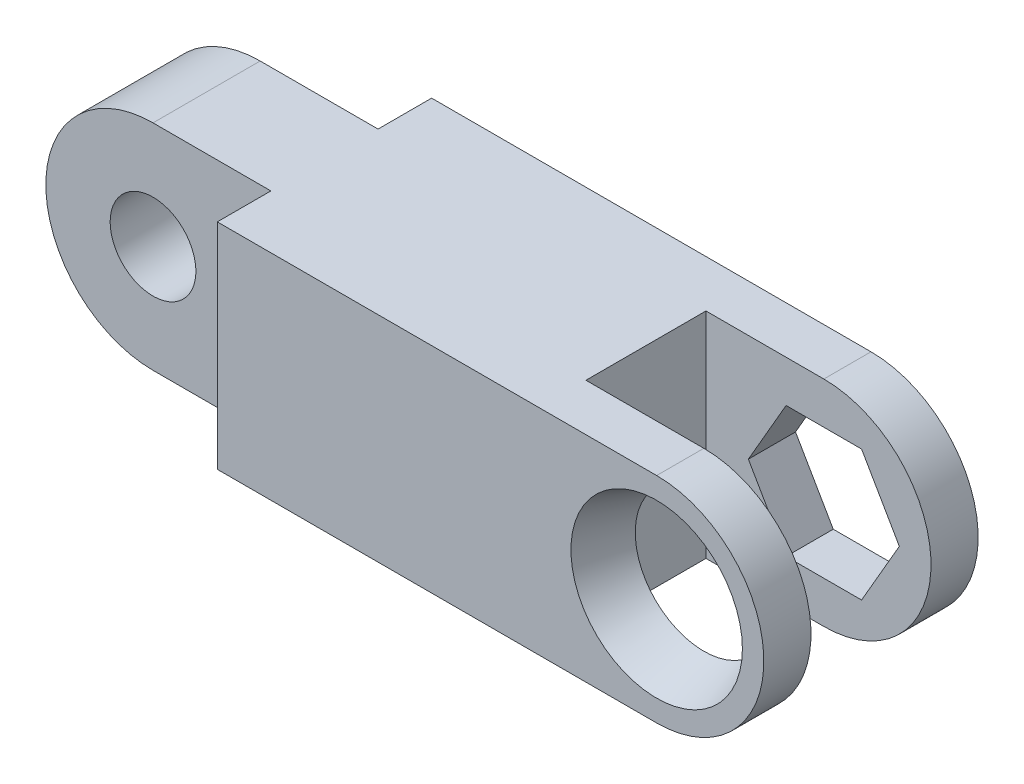
ISO-10303-21;
HEADER;
FILE_DESCRIPTION(('STEP AP214'),'2;1');
FILE_NAME('part.step','',(''),(''),'','','');
FILE_SCHEMA(('AUTOMOTIVE_DESIGN { 1 0 10303 214 1 1 1 1 }'));
ENDSEC;
DATA;
#1=APPLICATION_CONTEXT('core data for automotive mechanical design processes');
#2=APPLICATION_PROTOCOL_DEFINITION('international standard','automotive_design',2000,#1);
#3=PRODUCT_CONTEXT('',#1,'mechanical');
#4=PRODUCT('Part','Part','',(#3));
#5=PRODUCT_RELATED_PRODUCT_CATEGORY('part','',(#4));
#6=PRODUCT_DEFINITION_FORMATION('','',#4);
#7=PRODUCT_DEFINITION_CONTEXT('part definition',#1,'design');
#8=PRODUCT_DEFINITION('design','',#6,#7);
#9=PRODUCT_DEFINITION_SHAPE('','',#8);
#10=(LENGTH_UNIT() NAMED_UNIT(*) SI_UNIT(.MILLI.,.METRE.));
#11=(NAMED_UNIT(*) PLANE_ANGLE_UNIT() SI_UNIT($,.RADIAN.));
#12=(NAMED_UNIT(*) SI_UNIT($,.STERADIAN.) SOLID_ANGLE_UNIT());
#13=UNCERTAINTY_MEASURE_WITH_UNIT(LENGTH_MEASURE(1.E-05),#10,'distance_accuracy_value','');
#14=(GEOMETRIC_REPRESENTATION_CONTEXT(3) GLOBAL_UNCERTAINTY_ASSIGNED_CONTEXT((#13)) GLOBAL_UNIT_ASSIGNED_CONTEXT((#10,
#11,#12)) REPRESENTATION_CONTEXT('',''));
#15=CARTESIAN_POINT('',(0.,0.,0.));
#16=DIRECTION('',(0.,0.,1.));
#17=DIRECTION('',(1.,0.,0.));
#18=AXIS2_PLACEMENT_3D('',#15,#16,#17);
#19=CARTESIAN_POINT('',(13.,0.,10.));
#20=DIRECTION('',(0.,0.,-1.));
#21=DIRECTION('',(-1.,0.,0.));
#22=AXIS2_PLACEMENT_3D('',#19,#20,#21);
#23=CYLINDRICAL_SURFACE('',#22,5.);
#24=DIRECTION('',(0.,0.,-1.));
#25=VECTOR('',#24,1.);
#26=CARTESIAN_POINT('',(13.,5.,10.));
#27=LINE('',#26,#25);
#28=CARTESIAN_POINT('',(13.,5.,2.2));
#29=VERTEX_POINT('',#28);
#30=CARTESIAN_POINT('',(13.,5.,0.));
#31=VERTEX_POINT('',#30);
#32=EDGE_CURVE('E293',#29,#31,#27,.T.);
#33=ORIENTED_EDGE('',*,*,#32,.F.);
#34=CARTESIAN_POINT('',(13.,0.,2.2));
#35=DIRECTION('',(0.,0.,-1.));
#36=DIRECTION('',(-1.,0.,0.));
#37=AXIS2_PLACEMENT_3D('',#34,#35,#36);
#38=CIRCLE('',#37,5.);
#39=CARTESIAN_POINT('',(13.,-5.,2.2));
#40=VERTEX_POINT('',#39);
#41=EDGE_CURVE('E265',#29,#40,#38,.T.);
#42=ORIENTED_EDGE('',*,*,#41,.T.);
#43=DIRECTION('',(0.,0.,-1.));
#44=VECTOR('',#43,1.);
#45=CARTESIAN_POINT('',(13.,-5.,10.));
#46=LINE('',#45,#44);
#47=CARTESIAN_POINT('',(13.,-5.,0.));
#48=VERTEX_POINT('',#47);
#49=EDGE_CURVE('E277',#40,#48,#46,.T.);
#50=ORIENTED_EDGE('',*,*,#49,.T.);
#51=CARTESIAN_POINT('',(13.,0.,0.));
#52=DIRECTION('',(0.,0.,1.));
#53=DIRECTION('',(-1.,0.,0.));
#54=AXIS2_PLACEMENT_3D('',#51,#52,#53);
#55=CIRCLE('',#54,5.);
#56=EDGE_CURVE('E267',#48,#31,#55,.T.);
#57=ORIENTED_EDGE('',*,*,#56,.T.);
#58=EDGE_LOOP('',(#33,#42,#50,#57));
#59=FACE_BOUND('',#58,.T.);
#60=ADVANCED_FACE('F39',(#59),#23,.T.);
#61=CARTESIAN_POINT('',(13.,0.,7.8));
#62=DIRECTION('',(0.,0.,1.));
#63=DIRECTION('',(1.,0.,0.));
#64=AXIS2_PLACEMENT_3D('',#61,#62,#63);
#65=CIRCLE('',#64,5.);
#66=CARTESIAN_POINT('',(13.,-5.,7.8));
#67=VERTEX_POINT('',#66);
#68=CARTESIAN_POINT('',(13.,5.,7.8));
#69=VERTEX_POINT('',#68);
#70=EDGE_CURVE('E262',#67,#69,#65,.T.);
#71=ORIENTED_EDGE('',*,*,#70,.T.);
#72=CARTESIAN_POINT('',(13.,5.,10.));
#73=VERTEX_POINT('',#72);
#74=EDGE_CURVE('E294',#73,#69,#27,.T.);
#75=ORIENTED_EDGE('',*,*,#74,.F.);
#76=CARTESIAN_POINT('',(13.,0.,10.));
#77=DIRECTION('',(0.,0.,1.));
#78=DIRECTION('',(-1.,0.,0.));
#79=AXIS2_PLACEMENT_3D('',#76,#77,#78);
#80=CIRCLE('',#79,5.);
#81=CARTESIAN_POINT('',(13.,-5.,10.));
#82=VERTEX_POINT('',#81);
#83=EDGE_CURVE('E268',#82,#73,#80,.T.);
#84=ORIENTED_EDGE('',*,*,#83,.F.);
#85=EDGE_CURVE('E284',#82,#67,#46,.T.);
#86=ORIENTED_EDGE('',*,*,#85,.T.);
#87=EDGE_LOOP('',(#71,#75,#84,#86));
#88=FACE_BOUND('',#87,.T.);
#89=ADVANCED_FACE('F41',(#88),#23,.T.);
#90=CARTESIAN_POINT('',(-13.,5.,10.));
#91=DIRECTION('',(0.,-1.,0.));
#92=DIRECTION('',(0.,0.,-1.));
#93=AXIS2_PLACEMENT_3D('',#90,#91,#92);
#94=PLANE('',#93);
#95=DIRECTION('',(-1.,0.,0.));
#96=VECTOR('',#95,1.);
#97=CARTESIAN_POINT('',(-13.,5.,0.));
#98=LINE('',#97,#96);
#99=CARTESIAN_POINT('',(-7.50000000000001,5.,0.));
#100=VERTEX_POINT('',#99);
#101=EDGE_CURVE('E280',#31,#100,#98,.T.);
#102=ORIENTED_EDGE('',*,*,#101,.T.);
#103=DIRECTION('',(0.,0.,-1.));
#104=VECTOR('',#103,1.);
#105=CARTESIAN_POINT('',(-7.5,5.,0.));
#106=LINE('',#105,#104);
#107=CARTESIAN_POINT('',(-7.5,5.,2.5));
#108=VERTEX_POINT('',#107);
#109=EDGE_CURVE('E212',#108,#100,#106,.T.);
#110=ORIENTED_EDGE('',*,*,#109,.F.);
#111=DIRECTION('',(1.,0.,0.));
#112=VECTOR('',#111,1.);
#113=CARTESIAN_POINT('',(-18.,5.,2.5));
#114=LINE('',#113,#112);
#115=CARTESIAN_POINT('',(-13.,5.,2.5));
#116=VERTEX_POINT('',#115);
#117=EDGE_CURVE('E216',#116,#108,#114,.T.);
#118=ORIENTED_EDGE('',*,*,#117,.F.);
#119=DIRECTION('',(0.,0.,-1.));
#120=VECTOR('',#119,1.);
#121=CARTESIAN_POINT('',(-13.,5.,10.));
#122=LINE('',#121,#120);
#123=CARTESIAN_POINT('',(-13.,5.,7.5));
#124=VERTEX_POINT('',#123);
#125=EDGE_CURVE('E290',#124,#116,#122,.T.);
#126=ORIENTED_EDGE('',*,*,#125,.F.);
#127=DIRECTION('',(-1.,0.,0.));
#128=VECTOR('',#127,1.);
#129=CARTESIAN_POINT('',(-18.,5.,7.5));
#130=LINE('',#129,#128);
#131=CARTESIAN_POINT('',(-7.5,5.,7.5));
#132=VERTEX_POINT('',#131);
#133=EDGE_CURVE('E231',#132,#124,#130,.T.);
#134=ORIENTED_EDGE('',*,*,#133,.F.);
#135=DIRECTION('',(0.,0.,-1.));
#136=VECTOR('',#135,1.);
#137=CARTESIAN_POINT('',(-7.5,5.,10.));
#138=LINE('',#137,#136);
#139=CARTESIAN_POINT('',(-7.5,5.,10.));
#140=VERTEX_POINT('',#139);
#141=EDGE_CURVE('E218',#140,#132,#138,.T.);
#142=ORIENTED_EDGE('',*,*,#141,.F.);
#143=DIRECTION('',(-1.,0.,0.));
#144=VECTOR('',#143,1.);
#145=CARTESIAN_POINT('',(-13.,5.,10.));
#146=LINE('',#145,#144);
#147=EDGE_CURVE('E271',#73,#140,#146,.T.);
#148=ORIENTED_EDGE('',*,*,#147,.F.);
#149=ORIENTED_EDGE('',*,*,#74,.T.);
#150=DIRECTION('',(1.,0.,0.));
#151=VECTOR('',#150,1.);
#152=CARTESIAN_POINT('',(7.50000000000002,5.,7.8));
#153=LINE('',#152,#151);
#154=CARTESIAN_POINT('',(7.50000000000002,5.,7.8));
#155=VERTEX_POINT('',#154);
#156=EDGE_CURVE('E255',#155,#69,#153,.T.);
#157=ORIENTED_EDGE('',*,*,#156,.F.);
#158=DIRECTION('',(0.,0.,1.));
#159=VECTOR('',#158,1.);
#160=CARTESIAN_POINT('',(7.50000000000002,5.,7.8));
#161=LINE('',#160,#159);
#162=CARTESIAN_POINT('',(7.50000000000002,5.,2.2));
#163=VERTEX_POINT('',#162);
#164=EDGE_CURVE('E244',#163,#155,#161,.T.);
#165=ORIENTED_EDGE('',*,*,#164,.F.);
#166=DIRECTION('',(-1.,0.,0.));
#167=VECTOR('',#166,1.);
#168=CARTESIAN_POINT('',(7.50000000000002,5.,2.2));
#169=LINE('',#168,#167);
#170=EDGE_CURVE('E249',#29,#163,#169,.T.);
#171=ORIENTED_EDGE('',*,*,#170,.F.);
#172=ORIENTED_EDGE('',*,*,#32,.T.);
#173=EDGE_LOOP('',(#102,#110,#118,#126,#134,#142,#148,#149,#157,#165,#171,#172));
#174=FACE_BOUND('',#173,.T.);
#175=ADVANCED_FACE('F381',(#174),#94,.F.);
#176=CARTESIAN_POINT('',(-13.,0.,10.));
#177=DIRECTION('',(0.,0.,-1.));
#178=DIRECTION('',(-1.,0.,0.));
#179=AXIS2_PLACEMENT_3D('',#176,#177,#178);
#180=CYLINDRICAL_SURFACE('',#179,5.);
#181=ORIENTED_EDGE('',*,*,#125,.T.);
#182=CARTESIAN_POINT('',(-13.,0.,2.5));
#183=DIRECTION('',(0.,0.,1.));
#184=DIRECTION('',(1.,0.,0.));
#185=AXIS2_PLACEMENT_3D('',#182,#183,#184);
#186=CIRCLE('',#185,5.);
#187=CARTESIAN_POINT('',(-13.,-5.,2.5));
#188=VERTEX_POINT('',#187);
#189=EDGE_CURVE('E242',#116,#188,#186,.T.);
#190=ORIENTED_EDGE('',*,*,#189,.T.);
#191=DIRECTION('',(0.,0.,-1.));
#192=VECTOR('',#191,1.);
#193=CARTESIAN_POINT('',(-13.,-5.,10.));
#194=LINE('',#193,#192);
#195=CARTESIAN_POINT('',(-13.,-5.,7.5));
#196=VERTEX_POINT('',#195);
#197=EDGE_CURVE('E287',#196,#188,#194,.T.);
#198=ORIENTED_EDGE('',*,*,#197,.F.);
#199=CARTESIAN_POINT('',(-13.,0.,7.5));
#200=DIRECTION('',(0.,0.,-1.));
#201=DIRECTION('',(-1.,0.,0.));
#202=AXIS2_PLACEMENT_3D('',#199,#200,#201);
#203=CIRCLE('',#202,5.);
#204=EDGE_CURVE('E223',#196,#124,#203,.T.);
#205=ORIENTED_EDGE('',*,*,#204,.T.);
#206=EDGE_LOOP('',(#181,#190,#198,#205));
#207=FACE_BOUND('',#206,.T.);
#208=ADVANCED_FACE('F347',(#207),#180,.T.);
#209=CARTESIAN_POINT('',(-13.,-5.,10.));
#210=DIRECTION('',(0.,1.,0.));
#211=DIRECTION('',(0.,0.,1.));
#212=AXIS2_PLACEMENT_3D('',#209,#210,#211);
#213=PLANE('',#212);
#214=DIRECTION('',(1.,0.,0.));
#215=VECTOR('',#214,1.);
#216=CARTESIAN_POINT('',(-18.,-5.,2.5));
#217=LINE('',#216,#215);
#218=CARTESIAN_POINT('',(-7.5,-5.,2.5));
#219=VERTEX_POINT('',#218);
#220=EDGE_CURVE('E208',#188,#219,#217,.T.);
#221=ORIENTED_EDGE('',*,*,#220,.T.);
#222=DIRECTION('',(0.,0.,-1.));
#223=VECTOR('',#222,1.);
#224=CARTESIAN_POINT('',(-7.5,-5.,0.));
#225=LINE('',#224,#223);
#226=CARTESIAN_POINT('',(-7.5,-5.,0.));
#227=VERTEX_POINT('',#226);
#228=EDGE_CURVE('E211',#219,#227,#225,.T.);
#229=ORIENTED_EDGE('',*,*,#228,.T.);
#230=DIRECTION('',(1.,0.,0.));
#231=VECTOR('',#230,1.);
#232=CARTESIAN_POINT('',(-13.,-5.,0.));
#233=LINE('',#232,#231);
#234=EDGE_CURVE('E272',#227,#48,#233,.T.);
#235=ORIENTED_EDGE('',*,*,#234,.T.);
#236=ORIENTED_EDGE('',*,*,#49,.F.);
#237=DIRECTION('',(-1.,0.,0.));
#238=VECTOR('',#237,1.);
#239=CARTESIAN_POINT('',(-13.,-5.,2.2));
#240=LINE('',#239,#238);
#241=CARTESIAN_POINT('',(7.50000000000002,-5.,2.2));
#242=VERTEX_POINT('',#241);
#243=EDGE_CURVE('E297',#40,#242,#240,.T.);
#244=ORIENTED_EDGE('',*,*,#243,.T.);
#245=DIRECTION('',(0.,0.,1.));
#246=VECTOR('',#245,1.);
#247=CARTESIAN_POINT('',(7.50000000000002,-5.,7.8));
#248=LINE('',#247,#246);
#249=CARTESIAN_POINT('',(7.50000000000002,-5.,7.8));
#250=VERTEX_POINT('',#249);
#251=EDGE_CURVE('E245',#242,#250,#248,.T.);
#252=ORIENTED_EDGE('',*,*,#251,.T.);
#253=DIRECTION('',(1.,0.,0.));
#254=VECTOR('',#253,1.);
#255=CARTESIAN_POINT('',(7.50000000000002,-5.,7.8));
#256=LINE('',#255,#254);
#257=EDGE_CURVE('E248',#250,#67,#256,.T.);
#258=ORIENTED_EDGE('',*,*,#257,.T.);
#259=ORIENTED_EDGE('',*,*,#85,.F.);
#260=DIRECTION('',(1.,0.,0.));
#261=VECTOR('',#260,1.);
#262=CARTESIAN_POINT('',(-13.,-5.,10.));
#263=LINE('',#262,#261);
#264=CARTESIAN_POINT('',(-7.5,-5.,10.));
#265=VERTEX_POINT('',#264);
#266=EDGE_CURVE('E275',#265,#82,#263,.T.);
#267=ORIENTED_EDGE('',*,*,#266,.F.);
#268=DIRECTION('',(0.,0.,-1.));
#269=VECTOR('',#268,1.);
#270=CARTESIAN_POINT('',(-7.5,-5.,10.));
#271=LINE('',#270,#269);
#272=CARTESIAN_POINT('',(-7.5,-5.,7.5));
#273=VERTEX_POINT('',#272);
#274=EDGE_CURVE('E234',#265,#273,#271,.T.);
#275=ORIENTED_EDGE('',*,*,#274,.T.);
#276=DIRECTION('',(-1.,0.,0.));
#277=VECTOR('',#276,1.);
#278=CARTESIAN_POINT('',(-18.,-5.,7.5));
#279=LINE('',#278,#277);
#280=EDGE_CURVE('E228',#273,#196,#279,.T.);
#281=ORIENTED_EDGE('',*,*,#280,.T.);
#282=ORIENTED_EDGE('',*,*,#197,.T.);
#283=EDGE_LOOP('',(#221,#229,#235,#236,#244,#252,#258,#259,#267,#275,#281,#282));
#284=FACE_BOUND('',#283,.T.);
#285=ADVANCED_FACE('F345',(#284),#213,.F.);
#286=CARTESIAN_POINT('',(13.,0.,10.));
#287=DIRECTION('',(0.,0.,-1.));
#288=DIRECTION('',(-1.,0.,0.));
#289=AXIS2_PLACEMENT_3D('',#286,#287,#288);
#290=PLANE('',#289);
#291=CARTESIAN_POINT('',(13.,0.,10.));
#292=DIRECTION('',(0.,0.,1.));
#293=DIRECTION('',(1.,0.,0.));
#294=AXIS2_PLACEMENT_3D('',#291,#292,#293);
#295=CIRCLE('',#294,4.);
#296=CARTESIAN_POINT('',(17.,0.,10.));
#297=VERTEX_POINT('',#296);
#298=EDGE_CURVE('E198',#297,#297,#295,.T.);
#299=ORIENTED_EDGE('',*,*,#298,.F.);
#300=EDGE_LOOP('',(#299));
#301=FACE_BOUND('',#300,.T.);
#302=ORIENTED_EDGE('',*,*,#147,.T.);
#303=DIRECTION('',(0.,1.,0.));
#304=VECTOR('',#303,1.);
#305=CARTESIAN_POINT('',(-7.5,-5.,10.));
#306=LINE('',#305,#304);
#307=EDGE_CURVE('E226',#265,#140,#306,.T.);
#308=ORIENTED_EDGE('',*,*,#307,.F.);
#309=ORIENTED_EDGE('',*,*,#266,.T.);
#310=ORIENTED_EDGE('',*,*,#83,.T.);
#311=EDGE_LOOP('',(#302,#308,#309,#310));
#312=FACE_BOUND('',#311,.T.);
#313=ADVANCED_FACE('F376',(#301,#312),#290,.F.);
#314=CARTESIAN_POINT('',(13.,0.,0.));
#315=DIRECTION('',(0.,0.,-1.));
#316=DIRECTION('',(-1.,0.,0.));
#317=AXIS2_PLACEMENT_3D('',#314,#315,#316);
#318=PLANE('',#317);
#319=DIRECTION('',(0.5,-0.866025403784438,0.));
#320=VECTOR('',#319,1.);
#321=CARTESIAN_POINT('',(14.7609183210284,3.05,0.));
#322=LINE('',#321,#320);
#323=CARTESIAN_POINT('',(14.7609183210284,3.05,0.));
#324=VERTEX_POINT('',#323);
#325=CARTESIAN_POINT('',(16.5218366420567,0.,0.));
#326=VERTEX_POINT('',#325);
#327=EDGE_CURVE('E55',#324,#326,#322,.T.);
#328=ORIENTED_EDGE('',*,*,#327,.F.);
#329=DIRECTION('',(1.,0.,0.));
#330=VECTOR('',#329,1.);
#331=CARTESIAN_POINT('',(11.2390816789716,3.05,0.));
#332=LINE('',#331,#330);
#333=CARTESIAN_POINT('',(11.2390816789716,3.05,0.));
#334=VERTEX_POINT('',#333);
#335=EDGE_CURVE('E193',#334,#324,#332,.T.);
#336=ORIENTED_EDGE('',*,*,#335,.F.);
#337=DIRECTION('',(0.5,0.866025403784438,0.));
#338=VECTOR('',#337,1.);
#339=CARTESIAN_POINT('',(9.47816335794328,0.,0.));
#340=LINE('',#339,#338);
#341=CARTESIAN_POINT('',(9.47816335794328,0.,0.));
#342=VERTEX_POINT('',#341);
#343=EDGE_CURVE('E187',#342,#334,#340,.T.);
#344=ORIENTED_EDGE('',*,*,#343,.F.);
#345=DIRECTION('',(-0.5,0.866025403784439,0.));
#346=VECTOR('',#345,1.);
#347=CARTESIAN_POINT('',(11.2390816789716,-3.05,0.));
#348=LINE('',#347,#346);
#349=CARTESIAN_POINT('',(11.2390816789716,-3.05,0.));
#350=VERTEX_POINT('',#349);
#351=EDGE_CURVE('E185',#350,#342,#348,.T.);
#352=ORIENTED_EDGE('',*,*,#351,.F.);
#353=DIRECTION('',(-1.,0.,0.));
#354=VECTOR('',#353,1.);
#355=CARTESIAN_POINT('',(14.7609183210284,-3.05,0.));
#356=LINE('',#355,#354);
#357=CARTESIAN_POINT('',(14.7609183210284,-3.05,0.));
#358=VERTEX_POINT('',#357);
#359=EDGE_CURVE('E168',#358,#350,#356,.T.);
#360=ORIENTED_EDGE('',*,*,#359,.F.);
#361=DIRECTION('',(-0.5,-0.866025403784439,0.));
#362=VECTOR('',#361,1.);
#363=CARTESIAN_POINT('',(16.5218366420567,0.,0.));
#364=LINE('',#363,#362);
#365=EDGE_CURVE('E177',#326,#358,#364,.T.);
#366=ORIENTED_EDGE('',*,*,#365,.F.);
#367=EDGE_LOOP('',(#328,#336,#344,#352,#360,#366));
#368=FACE_BOUND('',#367,.T.);
#369=DIRECTION('',(0.,1.,0.));
#370=VECTOR('',#369,1.);
#371=CARTESIAN_POINT('',(-7.5,-5.,0.));
#372=LINE('',#371,#370);
#373=EDGE_CURVE('E220',#227,#100,#372,.T.);
#374=ORIENTED_EDGE('',*,*,#373,.T.);
#375=ORIENTED_EDGE('',*,*,#101,.F.);
#376=ORIENTED_EDGE('',*,*,#56,.F.);
#377=ORIENTED_EDGE('',*,*,#234,.F.);
#378=EDGE_LOOP('',(#374,#375,#376,#377));
#379=FACE_BOUND('',#378,.T.);
#380=ADVANCED_FACE('F181',(#368,#379),#318,.T.);
#381=CARTESIAN_POINT('',(7.50000000000002,-5.,2.2));
#382=DIRECTION('',(0.,0.,-1.));
#383=DIRECTION('',(-1.,0.,0.));
#384=AXIS2_PLACEMENT_3D('',#381,#382,#383);
#385=PLANE('',#384);
#386=DIRECTION('',(1.,0.,0.));
#387=VECTOR('',#386,1.);
#388=CARTESIAN_POINT('',(7.50000000000002,3.05,2.2));
#389=LINE('',#388,#387);
#390=CARTESIAN_POINT('',(11.2390816789716,3.05,2.2));
#391=VERTEX_POINT('',#390);
#392=CARTESIAN_POINT('',(14.7609183210284,3.05,2.2));
#393=VERTEX_POINT('',#392);
#394=EDGE_CURVE('E48',#391,#393,#389,.T.);
#395=ORIENTED_EDGE('',*,*,#394,.T.);
#396=DIRECTION('',(0.5,-0.866025403784438,0.));
#397=VECTOR('',#396,1.);
#398=CARTESIAN_POINT('',(16.4314409910036,0.156569860407203,2.2));
#399=LINE('',#398,#397);
#400=CARTESIAN_POINT('',(16.5218366420567,0.,2.2));
#401=VERTEX_POINT('',#400);
#402=EDGE_CURVE('E11',#393,#401,#399,.T.);
#403=ORIENTED_EDGE('',*,*,#402,.T.);
#404=DIRECTION('',(-0.5,-0.866025403784439,0.));
#405=VECTOR('',#404,1.);
#406=CARTESIAN_POINT('',(12.1013139720814,-7.6565698604072,2.2));
#407=LINE('',#406,#405);
#408=CARTESIAN_POINT('',(14.7609183210284,-3.05,2.2));
#409=VERTEX_POINT('',#408);
#410=EDGE_CURVE('E300',#401,#409,#407,.T.);
#411=ORIENTED_EDGE('',*,*,#410,.T.);
#412=DIRECTION('',(-1.,0.,0.));
#413=VECTOR('',#412,1.);
#414=CARTESIAN_POINT('',(7.50000000000002,-3.05,2.2));
#415=LINE('',#414,#413);
#416=CARTESIAN_POINT('',(11.2390816789716,-3.05,2.2));
#417=VERTEX_POINT('',#416);
#418=EDGE_CURVE('E171',#409,#417,#415,.T.);
#419=ORIENTED_EDGE('',*,*,#418,.T.);
#420=DIRECTION('',(-0.5,0.866025403784439,0.));
#421=VECTOR('',#420,1.);
#422=CARTESIAN_POINT('',(11.1486860279186,-2.8934301395928,2.2));
#423=LINE('',#422,#421);
#424=CARTESIAN_POINT('',(9.47816335794328,0.,2.2));
#425=VERTEX_POINT('',#424);
#426=EDGE_CURVE('E305',#417,#425,#423,.T.);
#427=ORIENTED_EDGE('',*,*,#426,.T.);
#428=DIRECTION('',(0.5,0.866025403784439,0.));
#429=VECTOR('',#428,1.);
#430=CARTESIAN_POINT('',(6.81855900899637,-4.6065698604072,2.2));
#431=LINE('',#430,#429);
#432=EDGE_CURVE('E308',#425,#391,#431,.T.);
#433=ORIENTED_EDGE('',*,*,#432,.T.);
#434=EDGE_LOOP('',(#395,#403,#411,#419,#427,#433));
#435=FACE_BOUND('',#434,.T.);
#436=ORIENTED_EDGE('',*,*,#170,.T.);
#437=DIRECTION('',(0.,1.,0.));
#438=VECTOR('',#437,1.);
#439=CARTESIAN_POINT('',(7.50000000000002,-5.,2.2));
#440=LINE('',#439,#438);
#441=EDGE_CURVE('E259',#242,#163,#440,.T.);
#442=ORIENTED_EDGE('',*,*,#441,.F.);
#443=ORIENTED_EDGE('',*,*,#243,.F.);
#444=ORIENTED_EDGE('',*,*,#41,.F.);
#445=EDGE_LOOP('',(#436,#442,#443,#444));
#446=FACE_BOUND('',#445,.T.);
#447=ADVANCED_FACE('F313',(#435,#446),#385,.F.);
#448=CARTESIAN_POINT('',(7.50000000000002,-5.,7.8));
#449=DIRECTION('',(0.,0.,1.));
#450=DIRECTION('',(1.,0.,0.));
#451=AXIS2_PLACEMENT_3D('',#448,#449,#450);
#452=PLANE('',#451);
#453=CARTESIAN_POINT('',(13.,0.,7.8));
#454=DIRECTION('',(0.,0.,1.));
#455=DIRECTION('',(1.,0.,0.));
#456=AXIS2_PLACEMENT_3D('',#453,#454,#455);
#457=CIRCLE('',#456,3.19926548461435);
#458=CARTESIAN_POINT('',(16.1992654846144,0.,7.8));
#459=VERTEX_POINT('',#458);
#460=EDGE_CURVE('E207',#459,#459,#457,.T.);
#461=ORIENTED_EDGE('',*,*,#460,.T.);
#462=EDGE_LOOP('',(#461));
#463=FACE_BOUND('',#462,.T.);
#464=ORIENTED_EDGE('',*,*,#70,.F.);
#465=ORIENTED_EDGE('',*,*,#257,.F.);
#466=DIRECTION('',(0.,1.,0.));
#467=VECTOR('',#466,1.);
#468=CARTESIAN_POINT('',(7.50000000000002,-5.,7.8));
#469=LINE('',#468,#467);
#470=EDGE_CURVE('E252',#250,#155,#469,.T.);
#471=ORIENTED_EDGE('',*,*,#470,.T.);
#472=ORIENTED_EDGE('',*,*,#156,.T.);
#473=EDGE_LOOP('',(#464,#465,#471,#472));
#474=FACE_BOUND('',#473,.T.);
#475=ADVANCED_FACE('F370',(#463,#474),#452,.F.);
#476=CARTESIAN_POINT('',(7.50000000000002,-5.,7.8));
#477=DIRECTION('',(-1.,0.,0.));
#478=DIRECTION('',(0.,0.,1.));
#479=AXIS2_PLACEMENT_3D('',#476,#477,#478);
#480=PLANE('',#479);
#481=ORIENTED_EDGE('',*,*,#164,.T.);
#482=ORIENTED_EDGE('',*,*,#470,.F.);
#483=ORIENTED_EDGE('',*,*,#251,.F.);
#484=ORIENTED_EDGE('',*,*,#441,.T.);
#485=EDGE_LOOP('',(#481,#482,#483,#484));
#486=FACE_BOUND('',#485,.T.);
#487=ADVANCED_FACE('F366',(#486),#480,.F.);
#488=CARTESIAN_POINT('',(-18.,-5.,2.5));
#489=DIRECTION('',(0.,0.,1.));
#490=DIRECTION('',(1.,0.,0.));
#491=AXIS2_PLACEMENT_3D('',#488,#489,#490);
#492=PLANE('',#491);
#493=CARTESIAN_POINT('',(-13.,0.,2.5));
#494=DIRECTION('',(0.,0.,1.));
#495=DIRECTION('',(1.,0.,0.));
#496=AXIS2_PLACEMENT_3D('',#493,#494,#495);
#497=CIRCLE('',#496,2.);
#498=CARTESIAN_POINT('',(-11.,0.,2.5));
#499=VERTEX_POINT('',#498);
#500=EDGE_CURVE('E323',#499,#499,#497,.F.);
#501=ORIENTED_EDGE('',*,*,#500,.F.);
#502=EDGE_LOOP('',(#501));
#503=FACE_BOUND('',#502,.T.);
#504=ORIENTED_EDGE('',*,*,#117,.T.);
#505=DIRECTION('',(0.,1.,0.));
#506=VECTOR('',#505,1.);
#507=CARTESIAN_POINT('',(-7.5,-5.,2.5));
#508=LINE('',#507,#506);
#509=EDGE_CURVE('E215',#219,#108,#508,.T.);
#510=ORIENTED_EDGE('',*,*,#509,.F.);
#511=ORIENTED_EDGE('',*,*,#220,.F.);
#512=ORIENTED_EDGE('',*,*,#189,.F.);
#513=EDGE_LOOP('',(#504,#510,#511,#512));
#514=FACE_BOUND('',#513,.T.);
#515=ADVANCED_FACE('F351',(#503,#514),#492,.F.);
#516=CARTESIAN_POINT('',(-7.5,-5.,0.));
#517=DIRECTION('',(1.,0.,0.));
#518=DIRECTION('',(0.,0.,-1.));
#519=AXIS2_PLACEMENT_3D('',#516,#517,#518);
#520=PLANE('',#519);
#521=ORIENTED_EDGE('',*,*,#109,.T.);
#522=ORIENTED_EDGE('',*,*,#373,.F.);
#523=ORIENTED_EDGE('',*,*,#228,.F.);
#524=ORIENTED_EDGE('',*,*,#509,.T.);
#525=EDGE_LOOP('',(#521,#522,#523,#524));
#526=FACE_BOUND('',#525,.T.);
#527=ADVANCED_FACE('F337',(#526),#520,.F.);
#528=CARTESIAN_POINT('',(-18.,-5.,7.5));
#529=DIRECTION('',(0.,0.,-1.));
#530=DIRECTION('',(-1.,0.,0.));
#531=AXIS2_PLACEMENT_3D('',#528,#529,#530);
#532=PLANE('',#531);
#533=CARTESIAN_POINT('',(-13.,0.,7.5));
#534=DIRECTION('',(0.,0.,-1.));
#535=DIRECTION('',(-1.,0.,0.));
#536=AXIS2_PLACEMENT_3D('',#533,#534,#535);
#537=CIRCLE('',#536,2.);
#538=CARTESIAN_POINT('',(-15.,0.,7.5));
#539=VERTEX_POINT('',#538);
#540=EDGE_CURVE('E43',#539,#539,#537,.F.);
#541=ORIENTED_EDGE('',*,*,#540,.F.);
#542=EDGE_LOOP('',(#541));
#543=FACE_BOUND('',#542,.T.);
#544=ORIENTED_EDGE('',*,*,#204,.F.);
#545=ORIENTED_EDGE('',*,*,#280,.F.);
#546=DIRECTION('',(0.,1.,0.));
#547=VECTOR('',#546,1.);
#548=CARTESIAN_POINT('',(-7.5,-5.,7.5));
#549=LINE('',#548,#547);
#550=EDGE_CURVE('E229',#273,#132,#549,.T.);
#551=ORIENTED_EDGE('',*,*,#550,.T.);
#552=ORIENTED_EDGE('',*,*,#133,.T.);
#553=EDGE_LOOP('',(#544,#545,#551,#552));
#554=FACE_BOUND('',#553,.T.);
#555=ADVANCED_FACE('F333',(#543,#554),#532,.F.);
#556=CARTESIAN_POINT('',(-7.5,-5.,10.));
#557=DIRECTION('',(1.,0.,0.));
#558=DIRECTION('',(0.,0.,-1.));
#559=AXIS2_PLACEMENT_3D('',#556,#557,#558);
#560=PLANE('',#559);
#561=ORIENTED_EDGE('',*,*,#141,.T.);
#562=ORIENTED_EDGE('',*,*,#550,.F.);
#563=ORIENTED_EDGE('',*,*,#274,.F.);
#564=ORIENTED_EDGE('',*,*,#307,.T.);
#565=EDGE_LOOP('',(#561,#562,#563,#564));
#566=FACE_BOUND('',#565,.T.);
#567=ADVANCED_FACE('F336',(#566),#560,.F.);
#568=CARTESIAN_POINT('',(13.,0.,10.));
#569=DIRECTION('',(0.,0.,1.));
#570=DIRECTION('',(1.,0.,0.));
#571=AXIS2_PLACEMENT_3D('',#568,#569,#570);
#572=CONICAL_SURFACE('',#571,4.,0.349065850398867);
#573=ORIENTED_EDGE('',*,*,#298,.T.);
#574=EDGE_LOOP('',(#573));
#575=FACE_BOUND('',#574,.T.);
#576=ORIENTED_EDGE('',*,*,#460,.F.);
#577=EDGE_LOOP('',(#576));
#578=FACE_BOUND('',#577,.T.);
#579=ADVANCED_FACE('F418',(#575,#578),#572,.F.);
#580=CARTESIAN_POINT('',(14.7609183210284,3.05,2.5));
#581=DIRECTION('',(0.866025403784438,0.5,0.));
#582=DIRECTION('',(-0.5,0.866025403784438,0.));
#583=AXIS2_PLACEMENT_3D('',#580,#581,#582);
#584=PLANE('',#583);
#585=DIRECTION('',(0.,0.,-1.));
#586=VECTOR('',#585,1.);
#587=CARTESIAN_POINT('',(14.7609183210284,3.05,2.5));
#588=LINE('',#587,#586);
#589=EDGE_CURVE('E196',#393,#324,#588,.T.);
#590=ORIENTED_EDGE('',*,*,#589,.T.);
#591=ORIENTED_EDGE('',*,*,#327,.T.);
#592=DIRECTION('',(0.,0.,-1.));
#593=VECTOR('',#592,1.);
#594=CARTESIAN_POINT('',(16.5218366420567,0.,2.5));
#595=LINE('',#594,#593);
#596=EDGE_CURVE('E174',#401,#326,#595,.T.);
#597=ORIENTED_EDGE('',*,*,#596,.F.);
#598=ORIENTED_EDGE('',*,*,#402,.F.);
#599=EDGE_LOOP('',(#590,#591,#597,#598));
#600=FACE_BOUND('',#599,.T.);
#601=ADVANCED_FACE('F422',(#600),#584,.F.);
#602=CARTESIAN_POINT('',(11.2390816789716,3.05,2.5));
#603=DIRECTION('',(0.,1.,0.));
#604=DIRECTION('',(0.,0.,1.));
#605=AXIS2_PLACEMENT_3D('',#602,#603,#604);
#606=PLANE('',#605);
#607=DIRECTION('',(0.,0.,-1.));
#608=VECTOR('',#607,1.);
#609=CARTESIAN_POINT('',(11.2390816789716,3.05,2.5));
#610=LINE('',#609,#608);
#611=EDGE_CURVE('E199',#391,#334,#610,.T.);
#612=ORIENTED_EDGE('',*,*,#611,.T.);
#613=ORIENTED_EDGE('',*,*,#335,.T.);
#614=ORIENTED_EDGE('',*,*,#589,.F.);
#615=ORIENTED_EDGE('',*,*,#394,.F.);
#616=EDGE_LOOP('',(#612,#613,#614,#615));
#617=FACE_BOUND('',#616,.T.);
#618=ADVANCED_FACE('F318',(#617),#606,.F.);
#619=CARTESIAN_POINT('',(9.47816335794328,0.,2.5));
#620=DIRECTION('',(-0.866025403784438,0.5,0.));
#621=DIRECTION('',(-0.5,-0.866025403784439,0.));
#622=AXIS2_PLACEMENT_3D('',#619,#620,#621);
#623=PLANE('',#622);
#624=DIRECTION('',(0.,0.,-1.));
#625=VECTOR('',#624,1.);
#626=CARTESIAN_POINT('',(9.47816335794328,0.,2.5));
#627=LINE('',#626,#625);
#628=EDGE_CURVE('E201',#425,#342,#627,.T.);
#629=ORIENTED_EDGE('',*,*,#628,.T.);
#630=ORIENTED_EDGE('',*,*,#343,.T.);
#631=ORIENTED_EDGE('',*,*,#611,.F.);
#632=ORIENTED_EDGE('',*,*,#432,.F.);
#633=EDGE_LOOP('',(#629,#630,#631,#632));
#634=FACE_BOUND('',#633,.T.);
#635=ADVANCED_FACE('F320',(#634),#623,.F.);
#636=CARTESIAN_POINT('',(11.2390816789716,-3.05,2.5));
#637=DIRECTION('',(-0.866025403784438,-0.5,0.));
#638=DIRECTION('',(0.5,-0.866025403784439,0.));
#639=AXIS2_PLACEMENT_3D('',#636,#637,#638);
#640=PLANE('',#639);
#641=DIRECTION('',(0.,0.,-1.));
#642=VECTOR('',#641,1.);
#643=CARTESIAN_POINT('',(11.2390816789716,-3.05,2.5));
#644=LINE('',#643,#642);
#645=EDGE_CURVE('E173',#417,#350,#644,.T.);
#646=ORIENTED_EDGE('',*,*,#645,.T.);
#647=ORIENTED_EDGE('',*,*,#351,.T.);
#648=ORIENTED_EDGE('',*,*,#628,.F.);
#649=ORIENTED_EDGE('',*,*,#426,.F.);
#650=EDGE_LOOP('',(#646,#647,#648,#649));
#651=FACE_BOUND('',#650,.T.);
#652=ADVANCED_FACE('F434',(#651),#640,.F.);
#653=CARTESIAN_POINT('',(14.7609183210284,-3.05,2.5));
#654=DIRECTION('',(0.,-1.,0.));
#655=DIRECTION('',(1.,0.,0.));
#656=AXIS2_PLACEMENT_3D('',#653,#654,#655);
#657=PLANE('',#656);
#658=DIRECTION('',(0.,0.,-1.));
#659=VECTOR('',#658,1.);
#660=CARTESIAN_POINT('',(14.7609183210284,-3.05,2.5));
#661=LINE('',#660,#659);
#662=EDGE_CURVE('E63',#409,#358,#661,.T.);
#663=ORIENTED_EDGE('',*,*,#662,.T.);
#664=ORIENTED_EDGE('',*,*,#359,.T.);
#665=ORIENTED_EDGE('',*,*,#645,.F.);
#666=ORIENTED_EDGE('',*,*,#418,.F.);
#667=EDGE_LOOP('',(#663,#664,#665,#666));
#668=FACE_BOUND('',#667,.T.);
#669=ADVANCED_FACE('F165',(#668),#657,.F.);
#670=CARTESIAN_POINT('',(16.5218366420567,0.,2.5));
#671=DIRECTION('',(0.866025403784439,-0.5,0.));
#672=DIRECTION('',(0.5,0.866025403784439,0.));
#673=AXIS2_PLACEMENT_3D('',#670,#671,#672);
#674=PLANE('',#673);
#675=ORIENTED_EDGE('',*,*,#596,.T.);
#676=ORIENTED_EDGE('',*,*,#365,.T.);
#677=ORIENTED_EDGE('',*,*,#662,.F.);
#678=ORIENTED_EDGE('',*,*,#410,.F.);
#679=EDGE_LOOP('',(#675,#676,#677,#678));
#680=FACE_BOUND('',#679,.T.);
#681=ADVANCED_FACE('F178',(#680),#674,.F.);
#682=CARTESIAN_POINT('',(-13.,0.,9.));
#683=DIRECTION('',(0.,0.,-1.));
#684=DIRECTION('',(-1.,0.,0.));
#685=AXIS2_PLACEMENT_3D('',#682,#683,#684);
#686=CYLINDRICAL_SURFACE('',#685,2.);
#687=ORIENTED_EDGE('',*,*,#540,.T.);
#688=EDGE_LOOP('',(#687));
#689=FACE_BOUND('',#688,.T.);
#690=ORIENTED_EDGE('',*,*,#500,.T.);
#691=EDGE_LOOP('',(#690));
#692=FACE_BOUND('',#691,.T.);
#693=ADVANCED_FACE('F331',(#689,#692),#686,.F.);
#694=CLOSED_SHELL('',(#60,#89,#175,#208,#285,#313,#380,#447,#475,#487,#515,#527,#555,#567,#579,
#601,#618,#635,#652,#669,#681,#693));
#695=MANIFOLD_SOLID_BREP('B2',#694);
#696=ADVANCED_BREP_SHAPE_REPRESENTATION('',(#18,#695),#14);
#697=SHAPE_DEFINITION_REPRESENTATION(#9,#696);
ENDSEC;
END-ISO-10303-21;
